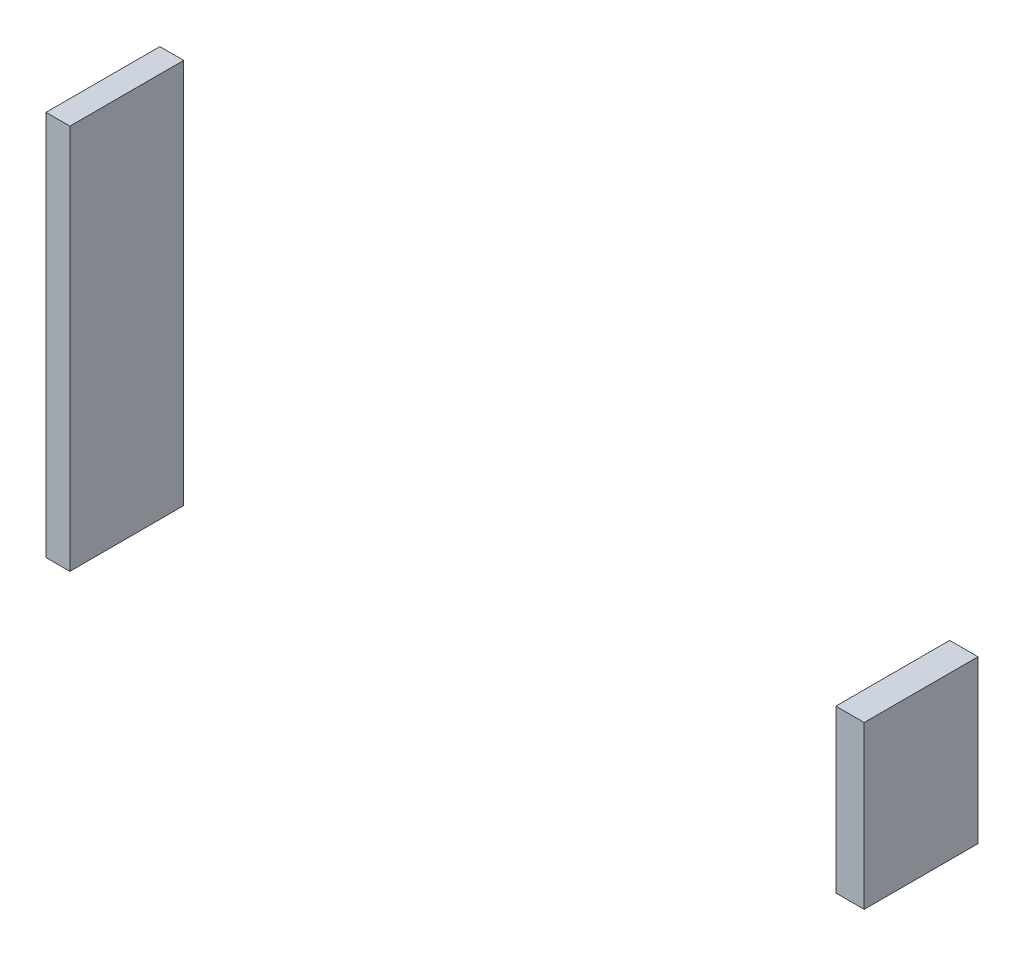
ISO-10303-21;
HEADER;
FILE_DESCRIPTION(('STEP AP214'),'2;1');
FILE_NAME('part.step','',(''),(''),'','','');
FILE_SCHEMA(('AUTOMOTIVE_DESIGN { 1 0 10303 214 1 1 1 1 }'));
ENDSEC;
DATA;
#1=APPLICATION_CONTEXT('core data for automotive mechanical design processes');
#2=APPLICATION_PROTOCOL_DEFINITION('international standard','automotive_design',2000,#1);
#3=PRODUCT_CONTEXT('',#1,'mechanical');
#4=PRODUCT('Part','Part','',(#3));
#5=PRODUCT_RELATED_PRODUCT_CATEGORY('part','',(#4));
#6=PRODUCT_DEFINITION_FORMATION('','',#4);
#7=PRODUCT_DEFINITION_CONTEXT('part definition',#1,'design');
#8=PRODUCT_DEFINITION('design','',#6,#7);
#9=PRODUCT_DEFINITION_SHAPE('','',#8);
#10=(LENGTH_UNIT() NAMED_UNIT(*) SI_UNIT(.MILLI.,.METRE.));
#11=(NAMED_UNIT(*) PLANE_ANGLE_UNIT() SI_UNIT($,.RADIAN.));
#12=(NAMED_UNIT(*) SI_UNIT($,.STERADIAN.) SOLID_ANGLE_UNIT());
#13=UNCERTAINTY_MEASURE_WITH_UNIT(LENGTH_MEASURE(1.E-05),#10,'distance_accuracy_value','');
#14=(GEOMETRIC_REPRESENTATION_CONTEXT(3) GLOBAL_UNCERTAINTY_ASSIGNED_CONTEXT((#13)) GLOBAL_UNIT_ASSIGNED_CONTEXT((#10,
#11,#12)) REPRESENTATION_CONTEXT('',''));
#15=CARTESIAN_POINT('',(0.,0.,0.));
#16=DIRECTION('',(0.,0.,1.));
#17=DIRECTION('',(1.,0.,0.));
#18=AXIS2_PLACEMENT_3D('',#15,#16,#17);
#19=CARTESIAN_POINT('',(37.3560198255852,7.46432440345503,10.5));
#20=DIRECTION('',(-1.,0.,0.));
#21=DIRECTION('',(0.,0.,1.));
#22=AXIS2_PLACEMENT_3D('',#19,#20,#21);
#23=PLANE('',#22);
#24=DIRECTION('',(0.,1.,0.));
#25=VECTOR('',#24,1.);
#26=CARTESIAN_POINT('',(37.3560198255852,7.46432440345503,0.));
#27=LINE('',#26,#25);
#28=CARTESIAN_POINT('',(37.3560198255852,-7.46432440345501,0.));
#29=VERTEX_POINT('',#28);
#30=CARTESIAN_POINT('',(37.3560198255852,7.46432440345503,0.));
#31=VERTEX_POINT('',#30);
#32=EDGE_CURVE('E107',#29,#31,#27,.T.);
#33=ORIENTED_EDGE('',*,*,#32,.T.);
#34=DIRECTION('',(0.,0.,-1.));
#35=VECTOR('',#34,1.);
#36=CARTESIAN_POINT('',(37.3560198255852,7.46432440345503,10.5));
#37=LINE('',#36,#35);
#38=CARTESIAN_POINT('',(37.3560198255852,7.46432440345503,10.5));
#39=VERTEX_POINT('',#38);
#40=EDGE_CURVE('E12',#39,#31,#37,.T.);
#41=ORIENTED_EDGE('',*,*,#40,.F.);
#42=DIRECTION('',(0.,1.,0.));
#43=VECTOR('',#42,1.);
#44=CARTESIAN_POINT('',(37.3560198255852,7.46432440345503,10.5));
#45=LINE('',#44,#43);
#46=CARTESIAN_POINT('',(37.3560198255852,-7.46432440345501,10.5));
#47=VERTEX_POINT('',#46);
#48=EDGE_CURVE('E95',#47,#39,#45,.T.);
#49=ORIENTED_EDGE('',*,*,#48,.F.);
#50=DIRECTION('',(0.,0.,-1.));
#51=VECTOR('',#50,1.);
#52=CARTESIAN_POINT('',(37.3560198255852,-7.46432440345501,10.5));
#53=LINE('',#52,#51);
#54=EDGE_CURVE('E103',#47,#29,#53,.T.);
#55=ORIENTED_EDGE('',*,*,#54,.T.);
#56=EDGE_LOOP('',(#33,#41,#49,#55));
#57=FACE_BOUND('',#56,.T.);
#58=ADVANCED_FACE('F44',(#57),#23,.F.);
#59=CARTESIAN_POINT('',(34.7417863939605,7.46432440345503,10.5));
#60=DIRECTION('',(0.,-1.,0.));
#61=DIRECTION('',(0.,0.,-1.));
#62=AXIS2_PLACEMENT_3D('',#59,#60,#61);
#63=PLANE('',#62);
#64=DIRECTION('',(-1.,0.,0.));
#65=VECTOR('',#64,1.);
#66=CARTESIAN_POINT('',(34.7417863939605,7.46432440345503,0.));
#67=LINE('',#66,#65);
#68=CARTESIAN_POINT('',(34.7417863939605,7.46432440345503,0.));
#69=VERTEX_POINT('',#68);
#70=EDGE_CURVE('E99',#31,#69,#67,.T.);
#71=ORIENTED_EDGE('',*,*,#70,.T.);
#72=DIRECTION('',(0.,0.,-1.));
#73=VECTOR('',#72,1.);
#74=CARTESIAN_POINT('',(34.7417863939605,7.46432440345503,10.5));
#75=LINE('',#74,#73);
#76=CARTESIAN_POINT('',(34.7417863939605,7.46432440345503,10.5));
#77=VERTEX_POINT('',#76);
#78=EDGE_CURVE('E52',#77,#69,#75,.T.);
#79=ORIENTED_EDGE('',*,*,#78,.F.);
#80=DIRECTION('',(-1.,0.,0.));
#81=VECTOR('',#80,1.);
#82=CARTESIAN_POINT('',(34.7417863939605,7.46432440345503,10.5));
#83=LINE('',#82,#81);
#84=EDGE_CURVE('E90',#39,#77,#83,.T.);
#85=ORIENTED_EDGE('',*,*,#84,.F.);
#86=ORIENTED_EDGE('',*,*,#40,.T.);
#87=EDGE_LOOP('',(#71,#79,#85,#86));
#88=FACE_BOUND('',#87,.T.);
#89=ADVANCED_FACE('F98',(#88),#63,.F.);
#90=CARTESIAN_POINT('',(34.7417863939605,7.46432440345503,10.5));
#91=DIRECTION('',(1.,0.,0.));
#92=DIRECTION('',(0.,0.,-1.));
#93=AXIS2_PLACEMENT_3D('',#90,#91,#92);
#94=PLANE('',#93);
#95=DIRECTION('',(0.,-1.,0.));
#96=VECTOR('',#95,1.);
#97=CARTESIAN_POINT('',(34.7417863939605,7.46432440345503,0.));
#98=LINE('',#97,#96);
#99=CARTESIAN_POINT('',(34.7417863939605,-7.46432440345501,0.));
#100=VERTEX_POINT('',#99);
#101=EDGE_CURVE('E77',#69,#100,#98,.T.);
#102=ORIENTED_EDGE('',*,*,#101,.T.);
#103=DIRECTION('',(0.,0.,-1.));
#104=VECTOR('',#103,1.);
#105=CARTESIAN_POINT('',(34.7417863939605,-7.46432440345501,10.5));
#106=LINE('',#105,#104);
#107=CARTESIAN_POINT('',(34.7417863939605,-7.46432440345501,10.5));
#108=VERTEX_POINT('',#107);
#109=EDGE_CURVE('E100',#108,#100,#106,.T.);
#110=ORIENTED_EDGE('',*,*,#109,.F.);
#111=DIRECTION('',(0.,-1.,0.));
#112=VECTOR('',#111,1.);
#113=CARTESIAN_POINT('',(34.7417863939605,7.46432440345503,10.5));
#114=LINE('',#113,#112);
#115=EDGE_CURVE('E93',#77,#108,#114,.T.);
#116=ORIENTED_EDGE('',*,*,#115,.F.);
#117=ORIENTED_EDGE('',*,*,#78,.T.);
#118=EDGE_LOOP('',(#102,#110,#116,#117));
#119=FACE_BOUND('',#118,.T.);
#120=ADVANCED_FACE('F101',(#119),#94,.F.);
#121=CARTESIAN_POINT('',(34.7417863939605,-7.46432440345501,10.5));
#122=DIRECTION('',(0.,1.,0.));
#123=DIRECTION('',(0.,0.,1.));
#124=AXIS2_PLACEMENT_3D('',#121,#122,#123);
#125=PLANE('',#124);
#126=DIRECTION('',(1.,0.,0.));
#127=VECTOR('',#126,1.);
#128=CARTESIAN_POINT('',(34.7417863939605,-7.46432440345501,0.));
#129=LINE('',#128,#127);
#130=EDGE_CURVE('E83',#100,#29,#129,.T.);
#131=ORIENTED_EDGE('',*,*,#130,.T.);
#132=ORIENTED_EDGE('',*,*,#54,.F.);
#133=DIRECTION('',(1.,0.,0.));
#134=VECTOR('',#133,1.);
#135=CARTESIAN_POINT('',(34.7417863939605,-7.46432440345501,10.5));
#136=LINE('',#135,#134);
#137=EDGE_CURVE('E60',#108,#47,#136,.T.);
#138=ORIENTED_EDGE('',*,*,#137,.F.);
#139=ORIENTED_EDGE('',*,*,#109,.T.);
#140=EDGE_LOOP('',(#131,#132,#138,#139));
#141=FACE_BOUND('',#140,.T.);
#142=ADVANCED_FACE('F114',(#141),#125,.F.);
#143=CARTESIAN_POINT('',(0.,0.,10.5));
#144=DIRECTION('',(0.,0.,1.));
#145=DIRECTION('',(1.,0.,0.));
#146=AXIS2_PLACEMENT_3D('',#143,#144,#145);
#147=PLANE('',#146);
#148=ORIENTED_EDGE('',*,*,#48,.T.);
#149=ORIENTED_EDGE('',*,*,#84,.T.);
#150=ORIENTED_EDGE('',*,*,#115,.T.);
#151=ORIENTED_EDGE('',*,*,#137,.T.);
#152=EDGE_LOOP('',(#148,#149,#150,#151));
#153=FACE_BOUND('',#152,.T.);
#154=ADVANCED_FACE('F91',(#153),#147,.T.);
#155=CARTESIAN_POINT('',(0.,0.,0.));
#156=DIRECTION('',(0.,0.,1.));
#157=DIRECTION('',(1.,0.,0.));
#158=AXIS2_PLACEMENT_3D('',#155,#156,#157);
#159=PLANE('',#158);
#160=ORIENTED_EDGE('',*,*,#32,.F.);
#161=ORIENTED_EDGE('',*,*,#130,.F.);
#162=ORIENTED_EDGE('',*,*,#101,.F.);
#163=ORIENTED_EDGE('',*,*,#70,.F.);
#164=EDGE_LOOP('',(#160,#161,#162,#163));
#165=FACE_BOUND('',#164,.T.);
#166=ADVANCED_FACE('F117',(#165),#159,.F.);
#167=CLOSED_SHELL('',(#58,#89,#120,#142,#154,#166));
#168=MANIFOLD_SOLID_BREP('B2',#167);
#169=CARTESIAN_POINT('',(-35.9113118765294,-17.0957107304933,10.5));
#170=DIRECTION('',(-1.,0.,0.));
#171=DIRECTION('',(0.,0.,1.));
#172=AXIS2_PLACEMENT_3D('',#169,#170,#171);
#173=PLANE('',#172);
#174=DIRECTION('',(0.,1.,0.));
#175=VECTOR('',#174,1.);
#176=CARTESIAN_POINT('',(-35.9113118765294,-17.0957107304933,0.));
#177=LINE('',#176,#175);
#178=CARTESIAN_POINT('',(-35.9113118765294,-17.0957107304933,0.));
#179=VERTEX_POINT('',#178);
#180=CARTESIAN_POINT('',(-35.9113118765294,18.4716230629276,0.));
#181=VERTEX_POINT('',#180);
#182=EDGE_CURVE('E230',#179,#181,#177,.T.);
#183=ORIENTED_EDGE('',*,*,#182,.T.);
#184=DIRECTION('',(0.,0.,-1.));
#185=VECTOR('',#184,1.);
#186=CARTESIAN_POINT('',(-35.9113118765294,18.4716230629276,10.5));
#187=LINE('',#186,#185);
#188=CARTESIAN_POINT('',(-35.9113118765294,18.4716230629276,10.5));
#189=VERTEX_POINT('',#188);
#190=EDGE_CURVE('E42',#189,#181,#187,.T.);
#191=ORIENTED_EDGE('',*,*,#190,.F.);
#192=DIRECTION('',(0.,1.,0.));
#193=VECTOR('',#192,1.);
#194=CARTESIAN_POINT('',(-35.9113118765294,-17.0957107304933,10.5));
#195=LINE('',#194,#193);
#196=CARTESIAN_POINT('',(-35.9113118765294,-17.0957107304933,10.5));
#197=VERTEX_POINT('',#196);
#198=EDGE_CURVE('E218',#197,#189,#195,.T.);
#199=ORIENTED_EDGE('',*,*,#198,.F.);
#200=DIRECTION('',(0.,0.,-1.));
#201=VECTOR('',#200,1.);
#202=CARTESIAN_POINT('',(-35.9113118765294,-17.0957107304933,10.5));
#203=LINE('',#202,#201);
#204=EDGE_CURVE('E226',#197,#179,#203,.T.);
#205=ORIENTED_EDGE('',*,*,#204,.T.);
#206=EDGE_LOOP('',(#183,#191,#199,#205));
#207=FACE_BOUND('',#206,.T.);
#208=ADVANCED_FACE('F167',(#207),#173,.F.);
#209=CARTESIAN_POINT('',(-35.9113118765294,18.4716230629276,10.5));
#210=DIRECTION('',(0.,-1.,0.));
#211=DIRECTION('',(0.,0.,-1.));
#212=AXIS2_PLACEMENT_3D('',#209,#210,#211);
#213=PLANE('',#212);
#214=DIRECTION('',(-1.,0.,0.));
#215=VECTOR('',#214,1.);
#216=CARTESIAN_POINT('',(-35.9113118765294,18.4716230629276,0.));
#217=LINE('',#216,#215);
#218=CARTESIAN_POINT('',(-38.1127716084238,18.4716230629276,0.));
#219=VERTEX_POINT('',#218);
#220=EDGE_CURVE('E222',#181,#219,#217,.T.);
#221=ORIENTED_EDGE('',*,*,#220,.T.);
#222=DIRECTION('',(0.,0.,-1.));
#223=VECTOR('',#222,1.);
#224=CARTESIAN_POINT('',(-38.1127716084238,18.4716230629276,10.5));
#225=LINE('',#224,#223);
#226=CARTESIAN_POINT('',(-38.1127716084238,18.4716230629276,10.5));
#227=VERTEX_POINT('',#226);
#228=EDGE_CURVE('E175',#227,#219,#225,.T.);
#229=ORIENTED_EDGE('',*,*,#228,.F.);
#230=DIRECTION('',(-1.,0.,0.));
#231=VECTOR('',#230,1.);
#232=CARTESIAN_POINT('',(-35.9113118765294,18.4716230629276,10.5));
#233=LINE('',#232,#231);
#234=EDGE_CURVE('E213',#189,#227,#233,.T.);
#235=ORIENTED_EDGE('',*,*,#234,.F.);
#236=ORIENTED_EDGE('',*,*,#190,.T.);
#237=EDGE_LOOP('',(#221,#229,#235,#236));
#238=FACE_BOUND('',#237,.T.);
#239=ADVANCED_FACE('F221',(#238),#213,.F.);
#240=CARTESIAN_POINT('',(-38.1127716084238,-17.0957107304933,10.5));
#241=DIRECTION('',(1.,0.,0.));
#242=DIRECTION('',(0.,0.,-1.));
#243=AXIS2_PLACEMENT_3D('',#240,#241,#242);
#244=PLANE('',#243);
#245=DIRECTION('',(0.,-1.,0.));
#246=VECTOR('',#245,1.);
#247=CARTESIAN_POINT('',(-38.1127716084238,-17.0957107304933,0.));
#248=LINE('',#247,#246);
#249=CARTESIAN_POINT('',(-38.1127716084238,-17.0957107304933,0.));
#250=VERTEX_POINT('',#249);
#251=EDGE_CURVE('E200',#219,#250,#248,.T.);
#252=ORIENTED_EDGE('',*,*,#251,.T.);
#253=DIRECTION('',(0.,0.,-1.));
#254=VECTOR('',#253,1.);
#255=CARTESIAN_POINT('',(-38.1127716084238,-17.0957107304933,10.5));
#256=LINE('',#255,#254);
#257=CARTESIAN_POINT('',(-38.1127716084238,-17.0957107304933,10.5));
#258=VERTEX_POINT('',#257);
#259=EDGE_CURVE('E223',#258,#250,#256,.T.);
#260=ORIENTED_EDGE('',*,*,#259,.F.);
#261=DIRECTION('',(0.,-1.,0.));
#262=VECTOR('',#261,1.);
#263=CARTESIAN_POINT('',(-38.1127716084238,-17.0957107304933,10.5));
#264=LINE('',#263,#262);
#265=EDGE_CURVE('E216',#227,#258,#264,.T.);
#266=ORIENTED_EDGE('',*,*,#265,.F.);
#267=ORIENTED_EDGE('',*,*,#228,.T.);
#268=EDGE_LOOP('',(#252,#260,#266,#267));
#269=FACE_BOUND('',#268,.T.);
#270=ADVANCED_FACE('F224',(#269),#244,.F.);
#271=CARTESIAN_POINT('',(-35.9113118765294,-17.0957107304933,10.5));
#272=DIRECTION('',(0.,1.,0.));
#273=DIRECTION('',(0.,0.,1.));
#274=AXIS2_PLACEMENT_3D('',#271,#272,#273);
#275=PLANE('',#274);
#276=DIRECTION('',(1.,0.,0.));
#277=VECTOR('',#276,1.);
#278=CARTESIAN_POINT('',(-35.9113118765294,-17.0957107304933,0.));
#279=LINE('',#278,#277);
#280=EDGE_CURVE('E206',#250,#179,#279,.T.);
#281=ORIENTED_EDGE('',*,*,#280,.T.);
#282=ORIENTED_EDGE('',*,*,#204,.F.);
#283=DIRECTION('',(1.,0.,0.));
#284=VECTOR('',#283,1.);
#285=CARTESIAN_POINT('',(-35.9113118765294,-17.0957107304933,10.5));
#286=LINE('',#285,#284);
#287=EDGE_CURVE('E183',#258,#197,#286,.T.);
#288=ORIENTED_EDGE('',*,*,#287,.F.);
#289=ORIENTED_EDGE('',*,*,#259,.T.);
#290=EDGE_LOOP('',(#281,#282,#288,#289));
#291=FACE_BOUND('',#290,.T.);
#292=ADVANCED_FACE('F237',(#291),#275,.F.);
#293=CARTESIAN_POINT('',(0.,0.,10.5));
#294=DIRECTION('',(0.,0.,1.));
#295=DIRECTION('',(1.,0.,0.));
#296=AXIS2_PLACEMENT_3D('',#293,#294,#295);
#297=PLANE('',#296);
#298=ORIENTED_EDGE('',*,*,#198,.T.);
#299=ORIENTED_EDGE('',*,*,#234,.T.);
#300=ORIENTED_EDGE('',*,*,#265,.T.);
#301=ORIENTED_EDGE('',*,*,#287,.T.);
#302=EDGE_LOOP('',(#298,#299,#300,#301));
#303=FACE_BOUND('',#302,.T.);
#304=ADVANCED_FACE('F214',(#303),#297,.T.);
#305=CARTESIAN_POINT('',(0.,0.,0.));
#306=DIRECTION('',(0.,0.,1.));
#307=DIRECTION('',(1.,0.,0.));
#308=AXIS2_PLACEMENT_3D('',#305,#306,#307);
#309=PLANE('',#308);
#310=ORIENTED_EDGE('',*,*,#182,.F.);
#311=ORIENTED_EDGE('',*,*,#280,.F.);
#312=ORIENTED_EDGE('',*,*,#251,.F.);
#313=ORIENTED_EDGE('',*,*,#220,.F.);
#314=EDGE_LOOP('',(#310,#311,#312,#313));
#315=FACE_BOUND('',#314,.T.);
#316=ADVANCED_FACE('F240',(#315),#309,.F.);
#317=CLOSED_SHELL('',(#208,#239,#270,#292,#304,#316));
#318=MANIFOLD_SOLID_BREP('B6',#317);
#319=ADVANCED_BREP_SHAPE_REPRESENTATION('',(#18,#168,#318),#14);
#320=SHAPE_DEFINITION_REPRESENTATION(#9,#319);
ENDSEC;
END-ISO-10303-21;
